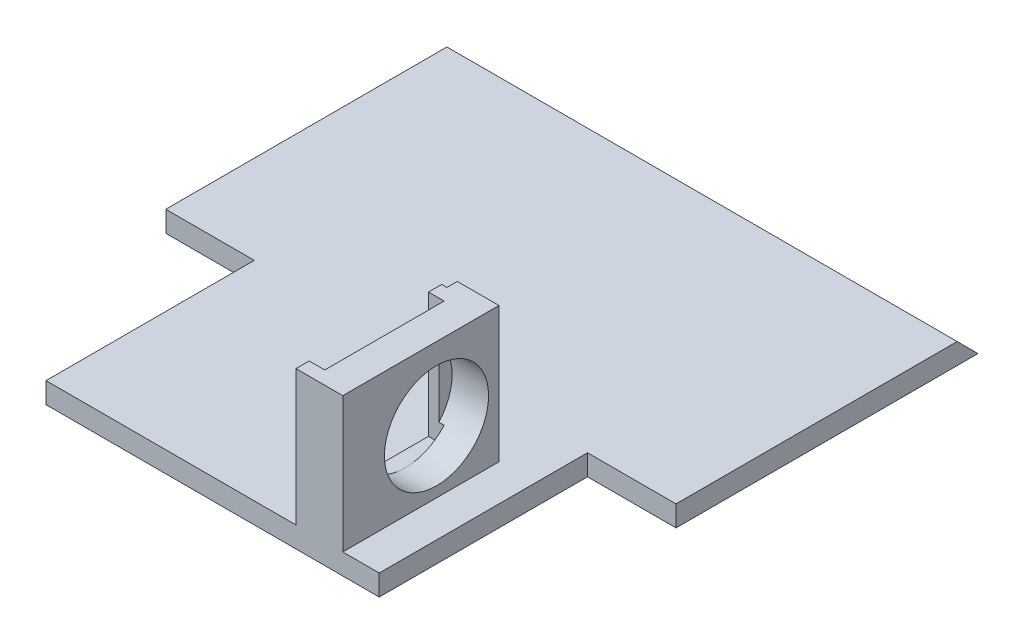
ISO-10303-21;
HEADER;
FILE_DESCRIPTION(('STEP AP214'),'2;1');
FILE_NAME('part.step','',(''),(''),'','','');
FILE_SCHEMA(('AUTOMOTIVE_DESIGN { 1 0 10303 214 1 1 1 1 }'));
ENDSEC;
DATA;
#1=APPLICATION_CONTEXT('core data for automotive mechanical design processes');
#2=APPLICATION_PROTOCOL_DEFINITION('international standard','automotive_design',2000,#1);
#3=PRODUCT_CONTEXT('',#1,'mechanical');
#4=PRODUCT('Part','Part','',(#3));
#5=PRODUCT_RELATED_PRODUCT_CATEGORY('part','',(#4));
#6=PRODUCT_DEFINITION_FORMATION('','',#4);
#7=PRODUCT_DEFINITION_CONTEXT('part definition',#1,'design');
#8=PRODUCT_DEFINITION('design','',#6,#7);
#9=PRODUCT_DEFINITION_SHAPE('','',#8);
#10=(LENGTH_UNIT() NAMED_UNIT(*) SI_UNIT(.MILLI.,.METRE.));
#11=(NAMED_UNIT(*) PLANE_ANGLE_UNIT() SI_UNIT($,.RADIAN.));
#12=(NAMED_UNIT(*) SI_UNIT($,.STERADIAN.) SOLID_ANGLE_UNIT());
#13=UNCERTAINTY_MEASURE_WITH_UNIT(LENGTH_MEASURE(1.E-05),#10,'distance_accuracy_value','');
#14=(GEOMETRIC_REPRESENTATION_CONTEXT(3) GLOBAL_UNCERTAINTY_ASSIGNED_CONTEXT((#13)) GLOBAL_UNIT_ASSIGNED_CONTEXT((#10,
#11,#12)) REPRESENTATION_CONTEXT('',''));
#15=CARTESIAN_POINT('',(0.,0.,0.));
#16=DIRECTION('',(0.,0.,1.));
#17=DIRECTION('',(1.,0.,0.));
#18=AXIS2_PLACEMENT_3D('',#15,#16,#17);
#19=CARTESIAN_POINT('',(9.5,0.,0.));
#20=DIRECTION('',(-1.,0.,0.));
#21=DIRECTION('',(0.,0.,1.));
#22=AXIS2_PLACEMENT_3D('',#19,#20,#21);
#23=PLANE('',#22);
#24=CARTESIAN_POINT('',(9.5,8.00000000000014,15.4999999999996));
#25=DIRECTION('',(-1.,0.,0.));
#26=DIRECTION('',(0.,0.,1.));
#27=AXIS2_PLACEMENT_3D('',#24,#25,#26);
#28=CIRCLE('',#27,5.);
#29=CARTESIAN_POINT('',(9.5,4.67226579229288,11.7682195880709));
#30=VERTEX_POINT('',#29);
#31=CARTESIAN_POINT('',(9.49999999999996,3.00000000000011,15.4999999999996));
#32=VERTEX_POINT('',#31);
#33=EDGE_CURVE('E361',#30,#32,#28,.T.);
#34=ORIENTED_EDGE('',*,*,#33,.F.);
#35=DIRECTION('',(0.,1.,0.));
#36=VECTOR('',#35,1.);
#37=CARTESIAN_POINT('',(9.5,0.035723816881739,11.7682195880708));
#38=LINE('',#37,#36);
#39=CARTESIAN_POINT('',(9.5,3.00000000000009,11.7682195880709));
#40=VERTEX_POINT('',#39);
#41=EDGE_CURVE('E291',#40,#30,#38,.T.);
#42=ORIENTED_EDGE('',*,*,#41,.F.);
#43=DIRECTION('',(0.,0.,-1.));
#44=VECTOR('',#43,1.);
#45=CARTESIAN_POINT('',(9.49999999999996,3.00000000000009,25.0345560496603));
#46=LINE('',#45,#44);
#47=EDGE_CURVE('E58',#32,#40,#46,.T.);
#48=ORIENTED_EDGE('',*,*,#47,.F.);
#49=EDGE_LOOP('',(#34,#42,#48));
#50=FACE_BOUND('',#49,.T.);
#51=ADVANCED_FACE('F35',(#50),#23,.T.);
#52=CARTESIAN_POINT('',(0.,2.,0.));
#53=DIRECTION('',(0.,1.,0.));
#54=DIRECTION('',(0.,0.,1.));
#55=AXIS2_PLACEMENT_3D('',#52,#53,#54);
#56=PLANE('',#55);
#57=DIRECTION('',(1.,0.,0.));
#58=VECTOR('',#57,1.);
#59=CARTESIAN_POINT('',(-27.3284271247462,2.,-22.5));
#60=LINE('',#59,#58);
#61=CARTESIAN_POINT('',(-24.5,2.,-22.5));
#62=VERTEX_POINT('',#61);
#63=CARTESIAN_POINT('',(24.5,2.,-22.5));
#64=VERTEX_POINT('',#63);
#65=EDGE_CURVE('E179',#62,#64,#60,.T.);
#66=ORIENTED_EDGE('',*,*,#65,.F.);
#67=DIRECTION('',(0.,0.,-1.));
#68=VECTOR('',#67,1.);
#69=CARTESIAN_POINT('',(-24.5,2.,0.));
#70=LINE('',#69,#68);
#71=CARTESIAN_POINT('',(-24.5,2.,4.50000000000001));
#72=VERTEX_POINT('',#71);
#73=EDGE_CURVE('E192',#72,#62,#70,.T.);
#74=ORIENTED_EDGE('',*,*,#73,.F.);
#75=DIRECTION('',(1.,0.,0.));
#76=VECTOR('',#75,1.);
#77=CARTESIAN_POINT('',(0.,2.,4.50000000000001));
#78=LINE('',#77,#76);
#79=CARTESIAN_POINT('',(-16.,2.,4.50000000000001));
#80=VERTEX_POINT('',#79);
#81=EDGE_CURVE('E200',#72,#80,#78,.T.);
#82=ORIENTED_EDGE('',*,*,#81,.T.);
#83=DIRECTION('',(0.,0.,1.));
#84=VECTOR('',#83,1.);
#85=CARTESIAN_POINT('',(-16.,2.,0.));
#86=LINE('',#85,#84);
#87=CARTESIAN_POINT('',(-16.,2.,24.5));
#88=VERTEX_POINT('',#87);
#89=EDGE_CURVE('E202',#80,#88,#86,.T.);
#90=ORIENTED_EDGE('',*,*,#89,.T.);
#91=DIRECTION('',(-1.,0.,0.));
#92=VECTOR('',#91,1.);
#93=CARTESIAN_POINT('',(0.,2.,24.5));
#94=LINE('',#93,#92);
#95=CARTESIAN_POINT('',(8.00000000000025,2.,24.4999999999997));
#96=VERTEX_POINT('',#95);
#97=EDGE_CURVE('E210',#96,#88,#94,.T.);
#98=ORIENTED_EDGE('',*,*,#97,.F.);
#99=DIRECTION('',(0.,0.,-1.));
#100=VECTOR('',#99,1.);
#101=CARTESIAN_POINT('',(8.00000000000037,2.,10.4999999999999));
#102=LINE('',#101,#100);
#103=CARTESIAN_POINT('',(8.00000000000037,2.,10.4999999999999));
#104=VERTEX_POINT('',#103);
#105=EDGE_CURVE('E265',#96,#104,#102,.T.);
#106=ORIENTED_EDGE('',*,*,#105,.T.);
#107=DIRECTION('',(1.,0.,0.));
#108=VECTOR('',#107,1.);
#109=CARTESIAN_POINT('',(9.5,2.,10.5000000000002));
#110=LINE('',#109,#108);
#111=CARTESIAN_POINT('',(8.5,2.,10.5000000000002));
#112=VERTEX_POINT('',#111);
#113=EDGE_CURVE('E305',#104,#112,#110,.T.);
#114=ORIENTED_EDGE('',*,*,#113,.T.);
#115=DIRECTION('',(0.,0.,-1.));
#116=VECTOR('',#115,1.);
#117=CARTESIAN_POINT('',(8.5,2.,10.5000000000002));
#118=LINE('',#117,#116);
#119=CARTESIAN_POINT('',(8.5,2.,9.50000000000025));
#120=VERTEX_POINT('',#119);
#121=EDGE_CURVE('E421',#112,#120,#118,.T.);
#122=ORIENTED_EDGE('',*,*,#121,.T.);
#123=DIRECTION('',(1.,0.,0.));
#124=VECTOR('',#123,1.);
#125=CARTESIAN_POINT('',(12.5,2.,9.50000000000025));
#126=LINE('',#125,#124);
#127=CARTESIAN_POINT('',(12.5,2.,9.50000000000025));
#128=VERTEX_POINT('',#127);
#129=EDGE_CURVE('E323',#120,#128,#126,.T.);
#130=ORIENTED_EDGE('',*,*,#129,.T.);
#131=DIRECTION('',(0.,0.,-1.));
#132=VECTOR('',#131,1.);
#133=CARTESIAN_POINT('',(12.5,2.,10.4999999999996));
#134=LINE('',#133,#132);
#135=CARTESIAN_POINT('',(12.5,2.,24.4999999999997));
#136=VERTEX_POINT('',#135);
#137=EDGE_CURVE('E320',#136,#128,#134,.T.);
#138=ORIENTED_EDGE('',*,*,#137,.F.);
#139=CARTESIAN_POINT('',(16.,2.,24.5));
#140=VERTEX_POINT('',#139);
#141=EDGE_CURVE('E211',#140,#136,#94,.T.);
#142=ORIENTED_EDGE('',*,*,#141,.F.);
#143=DIRECTION('',(0.,0.,1.));
#144=VECTOR('',#143,1.);
#145=CARTESIAN_POINT('',(16.,2.,0.));
#146=LINE('',#145,#144);
#147=CARTESIAN_POINT('',(16.,2.,4.50000000000001));
#148=VERTEX_POINT('',#147);
#149=EDGE_CURVE('E234',#148,#140,#146,.T.);
#150=ORIENTED_EDGE('',*,*,#149,.F.);
#151=DIRECTION('',(1.,0.,0.));
#152=VECTOR('',#151,1.);
#153=CARTESIAN_POINT('',(0.,2.,4.50000000000001));
#154=LINE('',#153,#152);
#155=CARTESIAN_POINT('',(24.5,2.,4.50000000000001));
#156=VERTEX_POINT('',#155);
#157=EDGE_CURVE('E204',#148,#156,#154,.T.);
#158=ORIENTED_EDGE('',*,*,#157,.T.);
#159=DIRECTION('',(0.,0.,-1.));
#160=VECTOR('',#159,1.);
#161=CARTESIAN_POINT('',(24.5,2.,0.));
#162=LINE('',#161,#160);
#163=EDGE_CURVE('E194',#156,#64,#162,.T.);
#164=ORIENTED_EDGE('',*,*,#163,.T.);
#165=EDGE_LOOP('',(#66,#74,#82,#90,#98,#106,#114,#122,#130,#138,#142,#150,#158,#164));
#166=FACE_BOUND('',#165,.T.);
#167=ADVANCED_FACE('F191',(#166),#56,.T.);
#168=CARTESIAN_POINT('',(9.5,11.3277342077076,11.768219588071));
#169=VERTEX_POINT('',#168);
#170=EDGE_CURVE('E367',#32,#169,#28,.T.);
#171=ORIENTED_EDGE('',*,*,#170,.F.);
#172=CARTESIAN_POINT('',(9.5,3.00000000000009,23.2317804119286));
#173=VERTEX_POINT('',#172);
#174=EDGE_CURVE('E338',#173,#32,#46,.T.);
#175=ORIENTED_EDGE('',*,*,#174,.F.);
#176=DIRECTION('',(0.,1.,0.));
#177=VECTOR('',#176,1.);
#178=CARTESIAN_POINT('',(9.5,0.0357238168814805,23.2317804119285));
#179=LINE('',#178,#177);
#180=CARTESIAN_POINT('',(9.5,14.9999999999997,23.2317804119288));
#181=VERTEX_POINT('',#180);
#182=EDGE_CURVE('E283',#173,#181,#179,.T.);
#183=ORIENTED_EDGE('',*,*,#182,.T.);
#184=DIRECTION('',(0.,0.,1.));
#185=VECTOR('',#184,1.);
#186=CARTESIAN_POINT('',(9.50000000000001,15.0000000000002,24.5));
#187=LINE('',#186,#185);
#188=CARTESIAN_POINT('',(9.5,15.0000000000002,11.7682195880711));
#189=VERTEX_POINT('',#188);
#190=EDGE_CURVE('E290',#189,#181,#187,.T.);
#191=ORIENTED_EDGE('',*,*,#190,.F.);
#192=EDGE_CURVE('E298',#169,#189,#38,.T.);
#193=ORIENTED_EDGE('',*,*,#192,.F.);
#194=EDGE_LOOP('',(#171,#175,#183,#191,#193));
#195=FACE_BOUND('',#194,.T.);
#196=ADVANCED_FACE('F397',(#195),#23,.T.);
#197=CARTESIAN_POINT('',(9.5,0.035723816881739,11.7682195880708));
#198=DIRECTION('',(0.,0.,1.));
#199=DIRECTION('',(0.,-1.,0.));
#200=AXIS2_PLACEMENT_3D('',#197,#198,#199);
#201=PLANE('',#200);
#202=DIRECTION('',(1.,0.,0.));
#203=VECTOR('',#202,1.);
#204=CARTESIAN_POINT('',(9.,4.67226579229288,11.7682195880709));
#205=LINE('',#204,#203);
#206=CARTESIAN_POINT('',(9.,4.67226579229288,11.7682195880709));
#207=VERTEX_POINT('',#206);
#208=EDGE_CURVE('E365',#207,#30,#205,.T.);
#209=ORIENTED_EDGE('',*,*,#208,.F.);
#210=DIRECTION('',(0.,1.,0.));
#211=VECTOR('',#210,1.);
#212=CARTESIAN_POINT('',(9.,0.035723816881739,11.7682195880708));
#213=LINE('',#212,#211);
#214=CARTESIAN_POINT('',(9.,11.3277342077076,11.768219588071));
#215=VERTEX_POINT('',#214);
#216=EDGE_CURVE('E364',#207,#215,#213,.T.);
#217=ORIENTED_EDGE('',*,*,#216,.T.);
#218=DIRECTION('',(1.,0.,0.));
#219=VECTOR('',#218,1.);
#220=CARTESIAN_POINT('',(9.,11.3277342077076,11.768219588071));
#221=LINE('',#220,#219);
#222=EDGE_CURVE('E371',#169,#215,#221,.F.);
#223=ORIENTED_EDGE('',*,*,#222,.F.);
#224=ORIENTED_EDGE('',*,*,#192,.T.);
#225=DIRECTION('',(1.,0.,0.));
#226=VECTOR('',#225,1.);
#227=CARTESIAN_POINT('',(9.5,14.9999999999999,11.7682195880711));
#228=LINE('',#227,#226);
#229=CARTESIAN_POINT('',(8.00000000000037,14.9999999999999,11.7682195880711));
#230=VERTEX_POINT('',#229);
#231=EDGE_CURVE('E281',#230,#189,#228,.T.);
#232=ORIENTED_EDGE('',*,*,#231,.F.);
#233=DIRECTION('',(0.,1.,0.));
#234=VECTOR('',#233,1.);
#235=CARTESIAN_POINT('',(8.00000000000037,0.035723816881739,11.7682195880708));
#236=LINE('',#235,#234);
#237=CARTESIAN_POINT('',(8.00000000000037,3.00000000000009,11.7682195880709));
#238=VERTEX_POINT('',#237);
#239=EDGE_CURVE('E299',#238,#230,#236,.T.);
#240=ORIENTED_EDGE('',*,*,#239,.F.);
#241=DIRECTION('',(-1.,0.,0.));
#242=VECTOR('',#241,1.);
#243=CARTESIAN_POINT('',(8.00000000000025,3.00000000000009,11.7682195880708));
#244=LINE('',#243,#242);
#245=EDGE_CURVE('E327',#40,#238,#244,.T.);
#246=ORIENTED_EDGE('',*,*,#245,.F.);
#247=ORIENTED_EDGE('',*,*,#41,.T.);
#248=EDGE_LOOP('',(#209,#217,#223,#224,#232,#240,#246,#247));
#249=FACE_BOUND('',#248,.T.);
#250=ADVANCED_FACE('F357',(#249),#201,.T.);
#251=CARTESIAN_POINT('',(9.5,0.0357238168814805,23.2317804119285));
#252=DIRECTION('',(0.,0.,-1.));
#253=DIRECTION('',(0.,1.,0.));
#254=AXIS2_PLACEMENT_3D('',#251,#252,#253);
#255=PLANE('',#254);
#256=ORIENTED_EDGE('',*,*,#182,.F.);
#257=DIRECTION('',(1.,0.,0.));
#258=VECTOR('',#257,1.);
#259=CARTESIAN_POINT('',(8.00000000000025,3.00000000000009,23.2317804119286));
#260=LINE('',#259,#258);
#261=CARTESIAN_POINT('',(8.00000000000025,3.00000000000009,23.2317804119286));
#262=VERTEX_POINT('',#261);
#263=EDGE_CURVE('E340',#262,#173,#260,.T.);
#264=ORIENTED_EDGE('',*,*,#263,.F.);
#265=DIRECTION('',(0.,1.,0.));
#266=VECTOR('',#265,1.);
#267=CARTESIAN_POINT('',(8.00000000000025,0.0357238168814805,23.2317804119285));
#268=LINE('',#267,#266);
#269=CARTESIAN_POINT('',(8.00000000000025,14.9999999999997,23.2317804119288));
#270=VERTEX_POINT('',#269);
#271=EDGE_CURVE('E278',#262,#270,#268,.T.);
#272=ORIENTED_EDGE('',*,*,#271,.T.);
#273=DIRECTION('',(-1.,0.,0.));
#274=VECTOR('',#273,1.);
#275=CARTESIAN_POINT('',(9.5,14.9999999999997,23.2317804119288));
#276=LINE('',#275,#274);
#277=EDGE_CURVE('E342',#181,#270,#276,.T.);
#278=ORIENTED_EDGE('',*,*,#277,.F.);
#279=EDGE_LOOP('',(#256,#264,#272,#278));
#280=FACE_BOUND('',#279,.T.);
#281=ADVANCED_FACE('F352',(#280),#255,.T.);
#282=CARTESIAN_POINT('',(16.,2.,0.));
#283=DIRECTION('',(1.,0.,0.));
#284=DIRECTION('',(0.,0.,-1.));
#285=AXIS2_PLACEMENT_3D('',#282,#283,#284);
#286=PLANE('',#285);
#287=DIRECTION('',(0.,0.,1.));
#288=VECTOR('',#287,1.);
#289=CARTESIAN_POINT('',(16.,0.,0.));
#290=LINE('',#289,#288);
#291=CARTESIAN_POINT('',(16.,0.,4.50000000000001));
#292=VERTEX_POINT('',#291);
#293=CARTESIAN_POINT('',(16.,0.,24.5));
#294=VERTEX_POINT('',#293);
#295=EDGE_CURVE('E214',#292,#294,#290,.T.);
#296=ORIENTED_EDGE('',*,*,#295,.F.);
#297=DIRECTION('',(0.,-1.,0.));
#298=VECTOR('',#297,1.);
#299=CARTESIAN_POINT('',(16.,2.,4.50000000000001));
#300=LINE('',#299,#298);
#301=EDGE_CURVE('E11',#148,#292,#300,.T.);
#302=ORIENTED_EDGE('',*,*,#301,.F.);
#303=ORIENTED_EDGE('',*,*,#149,.T.);
#304=DIRECTION('',(0.,-1.,0.));
#305=VECTOR('',#304,1.);
#306=CARTESIAN_POINT('',(16.,2.,24.5));
#307=LINE('',#306,#305);
#308=EDGE_CURVE('E213',#140,#294,#307,.T.);
#309=ORIENTED_EDGE('',*,*,#308,.T.);
#310=EDGE_LOOP('',(#296,#302,#303,#309));
#311=FACE_BOUND('',#310,.T.);
#312=ADVANCED_FACE('F37',(#311),#286,.T.);
#313=CARTESIAN_POINT('',(0.,2.,4.50000000000001));
#314=DIRECTION('',(0.,0.,-1.));
#315=DIRECTION('',(-1.,0.,0.));
#316=AXIS2_PLACEMENT_3D('',#313,#314,#315);
#317=PLANE('',#316);
#318=DIRECTION('',(1.,0.,0.));
#319=VECTOR('',#318,1.);
#320=CARTESIAN_POINT('',(0.,0.,4.50000000000001));
#321=LINE('',#320,#319);
#322=CARTESIAN_POINT('',(24.5,0.,4.50000000000001));
#323=VERTEX_POINT('',#322);
#324=EDGE_CURVE('E217',#292,#323,#321,.T.);
#325=ORIENTED_EDGE('',*,*,#324,.T.);
#326=DIRECTION('',(0.,-1.,0.));
#327=VECTOR('',#326,1.);
#328=CARTESIAN_POINT('',(24.5,2.,4.50000000000001));
#329=LINE('',#328,#327);
#330=EDGE_CURVE('E44',#156,#323,#329,.T.);
#331=ORIENTED_EDGE('',*,*,#330,.F.);
#332=ORIENTED_EDGE('',*,*,#157,.F.);
#333=ORIENTED_EDGE('',*,*,#301,.T.);
#334=EDGE_LOOP('',(#325,#331,#332,#333));
#335=FACE_BOUND('',#334,.T.);
#336=ADVANCED_FACE('F314',(#335),#317,.F.);
#337=CARTESIAN_POINT('',(24.5,2.,0.));
#338=DIRECTION('',(-1.,0.,0.));
#339=DIRECTION('',(0.,0.,1.));
#340=AXIS2_PLACEMENT_3D('',#337,#338,#339);
#341=PLANE('',#340);
#342=DIRECTION('',(0.,0.,-1.));
#343=VECTOR('',#342,1.);
#344=CARTESIAN_POINT('',(24.5,0.,0.));
#345=LINE('',#344,#343);
#346=CARTESIAN_POINT('',(24.5,0.,-24.5));
#347=VERTEX_POINT('',#346);
#348=EDGE_CURVE('E220',#323,#347,#345,.T.);
#349=ORIENTED_EDGE('',*,*,#348,.T.);
#350=DIRECTION('',(0.,-0.707106781186543,-0.707106781186552));
#351=VECTOR('',#350,1.);
#352=CARTESIAN_POINT('',(24.5,0.,-24.5));
#353=LINE('',#352,#351);
#354=EDGE_CURVE('E195',#64,#347,#353,.T.);
#355=ORIENTED_EDGE('',*,*,#354,.F.);
#356=ORIENTED_EDGE('',*,*,#163,.F.);
#357=ORIENTED_EDGE('',*,*,#330,.T.);
#358=EDGE_LOOP('',(#349,#355,#356,#357));
#359=FACE_BOUND('',#358,.T.);
#360=ADVANCED_FACE('F246',(#359),#341,.F.);
#361=CARTESIAN_POINT('',(-24.5,2.,0.));
#362=DIRECTION('',(-1.,0.,0.));
#363=DIRECTION('',(0.,0.,1.));
#364=AXIS2_PLACEMENT_3D('',#361,#362,#363);
#365=PLANE('',#364);
#366=DIRECTION('',(0.,-0.707106781186543,-0.707106781186552));
#367=VECTOR('',#366,1.);
#368=CARTESIAN_POINT('',(-24.5,0.,-24.5));
#369=LINE('',#368,#367);
#370=CARTESIAN_POINT('',(-24.5,0.,-24.5));
#371=VERTEX_POINT('',#370);
#372=EDGE_CURVE('E176',#62,#371,#369,.T.);
#373=ORIENTED_EDGE('',*,*,#372,.T.);
#374=DIRECTION('',(0.,0.,-1.));
#375=VECTOR('',#374,1.);
#376=CARTESIAN_POINT('',(-24.5,0.,0.));
#377=LINE('',#376,#375);
#378=CARTESIAN_POINT('',(-24.5,0.,4.50000000000001));
#379=VERTEX_POINT('',#378);
#380=EDGE_CURVE('E224',#379,#371,#377,.T.);
#381=ORIENTED_EDGE('',*,*,#380,.F.);
#382=DIRECTION('',(0.,-1.,0.));
#383=VECTOR('',#382,1.);
#384=CARTESIAN_POINT('',(-24.5,2.,4.50000000000001));
#385=LINE('',#384,#383);
#386=EDGE_CURVE('E198',#72,#379,#385,.T.);
#387=ORIENTED_EDGE('',*,*,#386,.F.);
#388=ORIENTED_EDGE('',*,*,#73,.T.);
#389=EDGE_LOOP('',(#373,#381,#387,#388));
#390=FACE_BOUND('',#389,.T.);
#391=ADVANCED_FACE('F197',(#390),#365,.T.);
#392=CARTESIAN_POINT('',(0.,2.,4.50000000000001));
#393=DIRECTION('',(0.,0.,-1.));
#394=DIRECTION('',(-1.,0.,0.));
#395=AXIS2_PLACEMENT_3D('',#392,#393,#394);
#396=PLANE('',#395);
#397=DIRECTION('',(1.,0.,0.));
#398=VECTOR('',#397,1.);
#399=CARTESIAN_POINT('',(0.,0.,4.50000000000001));
#400=LINE('',#399,#398);
#401=CARTESIAN_POINT('',(-16.,0.,4.50000000000001));
#402=VERTEX_POINT('',#401);
#403=EDGE_CURVE('E226',#379,#402,#400,.T.);
#404=ORIENTED_EDGE('',*,*,#403,.T.);
#405=DIRECTION('',(0.,-1.,0.));
#406=VECTOR('',#405,1.);
#407=CARTESIAN_POINT('',(-16.,2.,4.50000000000001));
#408=LINE('',#407,#406);
#409=EDGE_CURVE('E238',#80,#402,#408,.T.);
#410=ORIENTED_EDGE('',*,*,#409,.F.);
#411=ORIENTED_EDGE('',*,*,#81,.F.);
#412=ORIENTED_EDGE('',*,*,#386,.T.);
#413=EDGE_LOOP('',(#404,#410,#411,#412));
#414=FACE_BOUND('',#413,.T.);
#415=ADVANCED_FACE('F257',(#414),#396,.F.);
#416=CARTESIAN_POINT('',(-16.,2.,0.));
#417=DIRECTION('',(1.,0.,0.));
#418=DIRECTION('',(0.,0.,-1.));
#419=AXIS2_PLACEMENT_3D('',#416,#417,#418);
#420=PLANE('',#419);
#421=DIRECTION('',(0.,0.,1.));
#422=VECTOR('',#421,1.);
#423=CARTESIAN_POINT('',(-16.,0.,0.));
#424=LINE('',#423,#422);
#425=CARTESIAN_POINT('',(-16.,0.,24.5));
#426=VERTEX_POINT('',#425);
#427=EDGE_CURVE('E228',#402,#426,#424,.T.);
#428=ORIENTED_EDGE('',*,*,#427,.T.);
#429=DIRECTION('',(0.,-1.,0.));
#430=VECTOR('',#429,1.);
#431=CARTESIAN_POINT('',(-16.,2.,24.5));
#432=LINE('',#431,#430);
#433=EDGE_CURVE('E236',#88,#426,#432,.T.);
#434=ORIENTED_EDGE('',*,*,#433,.F.);
#435=ORIENTED_EDGE('',*,*,#89,.F.);
#436=ORIENTED_EDGE('',*,*,#409,.T.);
#437=EDGE_LOOP('',(#428,#434,#435,#436));
#438=FACE_BOUND('',#437,.T.);
#439=ADVANCED_FACE('F260',(#438),#420,.F.);
#440=CARTESIAN_POINT('',(0.,2.,24.5));
#441=DIRECTION('',(0.,0.,1.));
#442=DIRECTION('',(1.,0.,0.));
#443=AXIS2_PLACEMENT_3D('',#440,#441,#442);
#444=PLANE('',#443);
#445=DIRECTION('',(0.,1.,0.));
#446=VECTOR('',#445,1.);
#447=CARTESIAN_POINT('',(12.5,-12.0801278403283,24.4999999999991));
#448=LINE('',#447,#446);
#449=CARTESIAN_POINT('',(12.5,14.9999999999996,24.4999999999997));
#450=VERTEX_POINT('',#449);
#451=EDGE_CURVE('E318',#136,#450,#448,.T.);
#452=ORIENTED_EDGE('',*,*,#451,.T.);
#453=DIRECTION('',(1.,0.,0.));
#454=VECTOR('',#453,1.);
#455=CARTESIAN_POINT('',(9.50000000000001,15.0000000000002,24.5));
#456=LINE('',#455,#454);
#457=CARTESIAN_POINT('',(8.00000000000025,14.9999999999996,24.4999999999997));
#458=VERTEX_POINT('',#457);
#459=EDGE_CURVE('E218',#458,#450,#456,.T.);
#460=ORIENTED_EDGE('',*,*,#459,.F.);
#461=DIRECTION('',(0.,1.,0.));
#462=VECTOR('',#461,1.);
#463=CARTESIAN_POINT('',(8.00000000000025,0.0357238168814528,24.4999999999994));
#464=LINE('',#463,#462);
#465=EDGE_CURVE('E272',#96,#458,#464,.T.);
#466=ORIENTED_EDGE('',*,*,#465,.F.);
#467=ORIENTED_EDGE('',*,*,#97,.T.);
#468=ORIENTED_EDGE('',*,*,#433,.T.);
#469=DIRECTION('',(-1.,0.,0.));
#470=VECTOR('',#469,1.);
#471=CARTESIAN_POINT('',(0.,0.,24.5));
#472=LINE('',#471,#470);
#473=EDGE_CURVE('E231',#294,#426,#472,.T.);
#474=ORIENTED_EDGE('',*,*,#473,.F.);
#475=ORIENTED_EDGE('',*,*,#308,.F.);
#476=ORIENTED_EDGE('',*,*,#141,.T.);
#477=EDGE_LOOP('',(#452,#460,#466,#467,#468,#474,#475,#476));
#478=FACE_BOUND('',#477,.T.);
#479=ADVANCED_FACE('F269',(#478),#444,.T.);
#480=CARTESIAN_POINT('',(0.,0.,0.));
#481=DIRECTION('',(0.,1.,0.));
#482=DIRECTION('',(0.,0.,1.));
#483=AXIS2_PLACEMENT_3D('',#480,#481,#482);
#484=PLANE('',#483);
#485=ORIENTED_EDGE('',*,*,#295,.T.);
#486=ORIENTED_EDGE('',*,*,#473,.T.);
#487=ORIENTED_EDGE('',*,*,#427,.F.);
#488=ORIENTED_EDGE('',*,*,#403,.F.);
#489=ORIENTED_EDGE('',*,*,#380,.T.);
#490=DIRECTION('',(-1.,0.,0.));
#491=VECTOR('',#490,1.);
#492=CARTESIAN_POINT('',(0.,0.,-24.5));
#493=LINE('',#492,#491);
#494=EDGE_CURVE('E182',#347,#371,#493,.T.);
#495=ORIENTED_EDGE('',*,*,#494,.F.);
#496=ORIENTED_EDGE('',*,*,#348,.F.);
#497=ORIENTED_EDGE('',*,*,#324,.F.);
#498=EDGE_LOOP('',(#485,#486,#487,#488,#489,#495,#496,#497));
#499=FACE_BOUND('',#498,.T.);
#500=ADVANCED_FACE('F251',(#499),#484,.F.);
#501=CARTESIAN_POINT('',(9.50000000000001,15.0000000000002,24.5));
#502=DIRECTION('',(0.,1.,0.));
#503=DIRECTION('',(0.,0.,1.));
#504=AXIS2_PLACEMENT_3D('',#501,#502,#503);
#505=PLANE('',#504);
#506=DIRECTION('',(0.,0.,1.));
#507=VECTOR('',#506,1.);
#508=CARTESIAN_POINT('',(12.5,15.,10.5000000000002));
#509=LINE('',#508,#507);
#510=CARTESIAN_POINT('',(12.5,15.0000000000002,9.50000000000025));
#511=VERTEX_POINT('',#510);
#512=EDGE_CURVE('E330',#511,#450,#509,.T.);
#513=ORIENTED_EDGE('',*,*,#512,.F.);
#514=DIRECTION('',(-1.,0.,0.));
#515=VECTOR('',#514,1.);
#516=CARTESIAN_POINT('',(12.5,15.0000000000002,9.50000000000025));
#517=LINE('',#516,#515);
#518=CARTESIAN_POINT('',(8.5,15.0000000000002,9.50000000000025));
#519=VERTEX_POINT('',#518);
#520=EDGE_CURVE('E369',#511,#519,#517,.T.);
#521=ORIENTED_EDGE('',*,*,#520,.T.);
#522=DIRECTION('',(0.,0.,1.));
#523=VECTOR('',#522,1.);
#524=CARTESIAN_POINT('',(8.5,15.0000000000002,10.5000000000002));
#525=LINE('',#524,#523);
#526=CARTESIAN_POINT('',(8.5,15.0000000000002,10.5000000000002));
#527=VERTEX_POINT('',#526);
#528=EDGE_CURVE('E430',#519,#527,#525,.T.);
#529=ORIENTED_EDGE('',*,*,#528,.T.);
#530=DIRECTION('',(1.,0.,0.));
#531=VECTOR('',#530,1.);
#532=CARTESIAN_POINT('',(9.5,15.0000000000002,10.5000000000002));
#533=LINE('',#532,#531);
#534=CARTESIAN_POINT('',(8.00000000000037,15.,10.5000000000002));
#535=VERTEX_POINT('',#534);
#536=EDGE_CURVE('E307',#535,#527,#533,.T.);
#537=ORIENTED_EDGE('',*,*,#536,.F.);
#538=DIRECTION('',(0.,0.,1.));
#539=VECTOR('',#538,1.);
#540=CARTESIAN_POINT('',(8.00000000000037,15.,10.5000000000002));
#541=LINE('',#540,#539);
#542=EDGE_CURVE('E277',#535,#230,#541,.T.);
#543=ORIENTED_EDGE('',*,*,#542,.T.);
#544=ORIENTED_EDGE('',*,*,#231,.T.);
#545=ORIENTED_EDGE('',*,*,#190,.T.);
#546=ORIENTED_EDGE('',*,*,#277,.T.);
#547=DIRECTION('',(0.,0.,1.));
#548=VECTOR('',#547,1.);
#549=CARTESIAN_POINT('',(8.00000000000025,14.9999999999996,24.4999999999997));
#550=LINE('',#549,#548);
#551=EDGE_CURVE('E286',#270,#458,#550,.T.);
#552=ORIENTED_EDGE('',*,*,#551,.T.);
#553=ORIENTED_EDGE('',*,*,#459,.T.);
#554=EDGE_LOOP('',(#513,#521,#529,#537,#543,#544,#545,#546,#552,#553));
#555=FACE_BOUND('',#554,.T.);
#556=ADVANCED_FACE('F346',(#555),#505,.T.);
#557=CARTESIAN_POINT('',(9.5,2.,10.5000000000002));
#558=DIRECTION('',(0.,0.,-1.));
#559=DIRECTION('',(-1.,0.,0.));
#560=AXIS2_PLACEMENT_3D('',#557,#558,#559);
#561=PLANE('',#560);
#562=DIRECTION('',(0.,1.,0.));
#563=VECTOR('',#562,1.);
#564=CARTESIAN_POINT('',(8.5,-2.12310562561766,10.5000000000002));
#565=LINE('',#564,#563);
#566=EDGE_CURVE('E420',#112,#527,#565,.T.);
#567=ORIENTED_EDGE('',*,*,#566,.F.);
#568=ORIENTED_EDGE('',*,*,#113,.F.);
#569=DIRECTION('',(0.,1.,0.));
#570=VECTOR('',#569,1.);
#571=CARTESIAN_POINT('',(8.00000000000037,0.0357238168817667,10.4999999999999));
#572=LINE('',#571,#570);
#573=EDGE_CURVE('E295',#104,#535,#572,.T.);
#574=ORIENTED_EDGE('',*,*,#573,.T.);
#575=ORIENTED_EDGE('',*,*,#536,.T.);
#576=EDGE_LOOP('',(#567,#568,#574,#575));
#577=FACE_BOUND('',#576,.T.);
#578=ADVANCED_FACE('F419',(#577),#561,.T.);
#579=CARTESIAN_POINT('',(8.00000000000037,0.0357238168817667,10.4999999999999));
#580=DIRECTION('',(-1.,0.,0.));
#581=DIRECTION('',(0.,-1.,0.));
#582=AXIS2_PLACEMENT_3D('',#579,#580,#581);
#583=PLANE('',#582);
#584=ORIENTED_EDGE('',*,*,#105,.F.);
#585=ORIENTED_EDGE('',*,*,#465,.T.);
#586=ORIENTED_EDGE('',*,*,#551,.F.);
#587=ORIENTED_EDGE('',*,*,#271,.F.);
#588=DIRECTION('',(0.,0.,-1.));
#589=VECTOR('',#588,1.);
#590=CARTESIAN_POINT('',(8.00000000000025,3.00000000000009,25.0345560496603));
#591=LINE('',#590,#589);
#592=EDGE_CURVE('E335',#262,#238,#591,.T.);
#593=ORIENTED_EDGE('',*,*,#592,.T.);
#594=ORIENTED_EDGE('',*,*,#239,.T.);
#595=ORIENTED_EDGE('',*,*,#542,.F.);
#596=ORIENTED_EDGE('',*,*,#573,.F.);
#597=EDGE_LOOP('',(#584,#585,#586,#587,#593,#594,#595,#596));
#598=FACE_BOUND('',#597,.T.);
#599=ADVANCED_FACE('F347',(#598),#583,.T.);
#600=CARTESIAN_POINT('',(8.00000000000025,3.00000000000009,25.0345560496603));
#601=DIRECTION('',(0.,-1.,0.));
#602=DIRECTION('',(0.,0.,-1.));
#603=AXIS2_PLACEMENT_3D('',#600,#601,#602);
#604=PLANE('',#603);
#605=ORIENTED_EDGE('',*,*,#174,.T.);
#606=ORIENTED_EDGE('',*,*,#47,.T.);
#607=ORIENTED_EDGE('',*,*,#245,.T.);
#608=ORIENTED_EDGE('',*,*,#592,.F.);
#609=ORIENTED_EDGE('',*,*,#263,.T.);
#610=EDGE_LOOP('',(#605,#606,#607,#608,#609));
#611=FACE_BOUND('',#610,.T.);
#612=ADVANCED_FACE('F353',(#611),#604,.F.);
#613=CARTESIAN_POINT('',(12.5,-12.080127840328,10.4999999999996));
#614=DIRECTION('',(-1.,0.,0.));
#615=DIRECTION('',(0.,-1.,0.));
#616=AXIS2_PLACEMENT_3D('',#613,#614,#615);
#617=PLANE('',#616);
#618=CARTESIAN_POINT('',(12.5,8.00000000000014,15.4999999999996));
#619=DIRECTION('',(-1.,0.,0.));
#620=DIRECTION('',(0.,-1.,0.));
#621=AXIS2_PLACEMENT_3D('',#618,#619,#620);
#622=CIRCLE('',#621,5.);
#623=CARTESIAN_POINT('',(12.5,3.00000000000013,15.4999999999996));
#624=VERTEX_POINT('',#623);
#625=EDGE_CURVE('E39',#624,#624,#622,.T.);
#626=ORIENTED_EDGE('',*,*,#625,.T.);
#627=EDGE_LOOP('',(#626));
#628=FACE_BOUND('',#627,.T.);
#629=ORIENTED_EDGE('',*,*,#137,.T.);
#630=DIRECTION('',(0.,1.,0.));
#631=VECTOR('',#630,1.);
#632=CARTESIAN_POINT('',(12.5,-2.12310562561766,9.50000000000025));
#633=LINE('',#632,#631);
#634=EDGE_CURVE('E431',#128,#511,#633,.T.);
#635=ORIENTED_EDGE('',*,*,#634,.T.);
#636=ORIENTED_EDGE('',*,*,#512,.T.);
#637=ORIENTED_EDGE('',*,*,#451,.F.);
#638=EDGE_LOOP('',(#629,#635,#636,#637));
#639=FACE_BOUND('',#638,.T.);
#640=ADVANCED_FACE('F329',(#628,#639),#617,.F.);
#641=CARTESIAN_POINT('',(8.5,-2.12310562561766,10.5000000000002));
#642=DIRECTION('',(-1.,0.,0.));
#643=DIRECTION('',(0.,0.,1.));
#644=AXIS2_PLACEMENT_3D('',#641,#642,#643);
#645=PLANE('',#644);
#646=ORIENTED_EDGE('',*,*,#121,.F.);
#647=ORIENTED_EDGE('',*,*,#566,.T.);
#648=ORIENTED_EDGE('',*,*,#528,.F.);
#649=DIRECTION('',(0.,1.,0.));
#650=VECTOR('',#649,1.);
#651=CARTESIAN_POINT('',(8.5,-2.12310562561766,9.50000000000025));
#652=LINE('',#651,#650);
#653=EDGE_CURVE('E425',#120,#519,#652,.T.);
#654=ORIENTED_EDGE('',*,*,#653,.F.);
#655=EDGE_LOOP('',(#646,#647,#648,#654));
#656=FACE_BOUND('',#655,.T.);
#657=ADVANCED_FACE('F391',(#656),#645,.T.);
#658=CARTESIAN_POINT('',(12.5,-2.12310562561766,9.50000000000025));
#659=DIRECTION('',(0.,0.,-1.));
#660=DIRECTION('',(-1.,0.,0.));
#661=AXIS2_PLACEMENT_3D('',#658,#659,#660);
#662=PLANE('',#661);
#663=ORIENTED_EDGE('',*,*,#129,.F.);
#664=ORIENTED_EDGE('',*,*,#653,.T.);
#665=ORIENTED_EDGE('',*,*,#520,.F.);
#666=ORIENTED_EDGE('',*,*,#634,.F.);
#667=EDGE_LOOP('',(#663,#664,#665,#666));
#668=FACE_BOUND('',#667,.T.);
#669=ADVANCED_FACE('F384',(#668),#662,.T.);
#670=CARTESIAN_POINT('',(9.,8.00000000000014,15.4999999999996));
#671=DIRECTION('',(1.,0.,0.));
#672=DIRECTION('',(0.,1.,0.));
#673=AXIS2_PLACEMENT_3D('',#670,#671,#672);
#674=CYLINDRICAL_SURFACE('',#673,5.);
#675=ORIENTED_EDGE('',*,*,#33,.T.);
#676=ORIENTED_EDGE('',*,*,#170,.T.);
#677=ORIENTED_EDGE('',*,*,#222,.T.);
#678=CARTESIAN_POINT('',(9.,8.00000000000014,15.4999999999996));
#679=DIRECTION('',(1.,0.,0.));
#680=DIRECTION('',(0.,1.,0.));
#681=AXIS2_PLACEMENT_3D('',#678,#679,#680);
#682=CIRCLE('',#681,5.);
#683=EDGE_CURVE('E50',#207,#215,#682,.T.);
#684=ORIENTED_EDGE('',*,*,#683,.F.);
#685=ORIENTED_EDGE('',*,*,#208,.T.);
#686=EDGE_LOOP('',(#675,#676,#677,#684,#685));
#687=FACE_BOUND('',#686,.T.);
#688=ORIENTED_EDGE('',*,*,#625,.F.);
#689=EDGE_LOOP('',(#688));
#690=FACE_BOUND('',#689,.T.);
#691=ADVANCED_FACE('F381',(#687,#690),#674,.F.);
#692=CARTESIAN_POINT('',(9.,8.00000000000014,15.4999999999996));
#693=DIRECTION('',(1.,0.,0.));
#694=DIRECTION('',(0.,1.,0.));
#695=AXIS2_PLACEMENT_3D('',#692,#693,#694);
#696=PLANE('',#695);
#697=ORIENTED_EDGE('',*,*,#683,.T.);
#698=ORIENTED_EDGE('',*,*,#216,.F.);
#699=EDGE_LOOP('',(#697,#698));
#700=FACE_BOUND('',#699,.T.);
#701=ADVANCED_FACE('F383',(#700),#696,.T.);
#702=CARTESIAN_POINT('',(-27.3284271247462,0.,-24.5));
#703=DIRECTION('',(0.,-0.707106781186552,0.707106781186543));
#704=DIRECTION('',(0.,-0.707106781186543,-0.707106781186552));
#705=AXIS2_PLACEMENT_3D('',#702,#703,#704);
#706=PLANE('',#705);
#707=ORIENTED_EDGE('',*,*,#65,.T.);
#708=ORIENTED_EDGE('',*,*,#354,.T.);
#709=ORIENTED_EDGE('',*,*,#494,.T.);
#710=ORIENTED_EDGE('',*,*,#372,.F.);
#711=EDGE_LOOP('',(#707,#708,#709,#710));
#712=FACE_BOUND('',#711,.T.);
#713=ADVANCED_FACE('F178',(#712),#706,.F.);
#714=CLOSED_SHELL('',(#51,#167,#196,#250,#281,#312,#336,#360,#391,#415,#439,#479,#500,#556,#578,
#599,#612,#640,#657,#669,#691,#701,#713));
#715=MANIFOLD_SOLID_BREP('B2',#714);
#716=ADVANCED_BREP_SHAPE_REPRESENTATION('',(#18,#715),#14);
#717=SHAPE_DEFINITION_REPRESENTATION(#9,#716);
ENDSEC;
END-ISO-10303-21;
